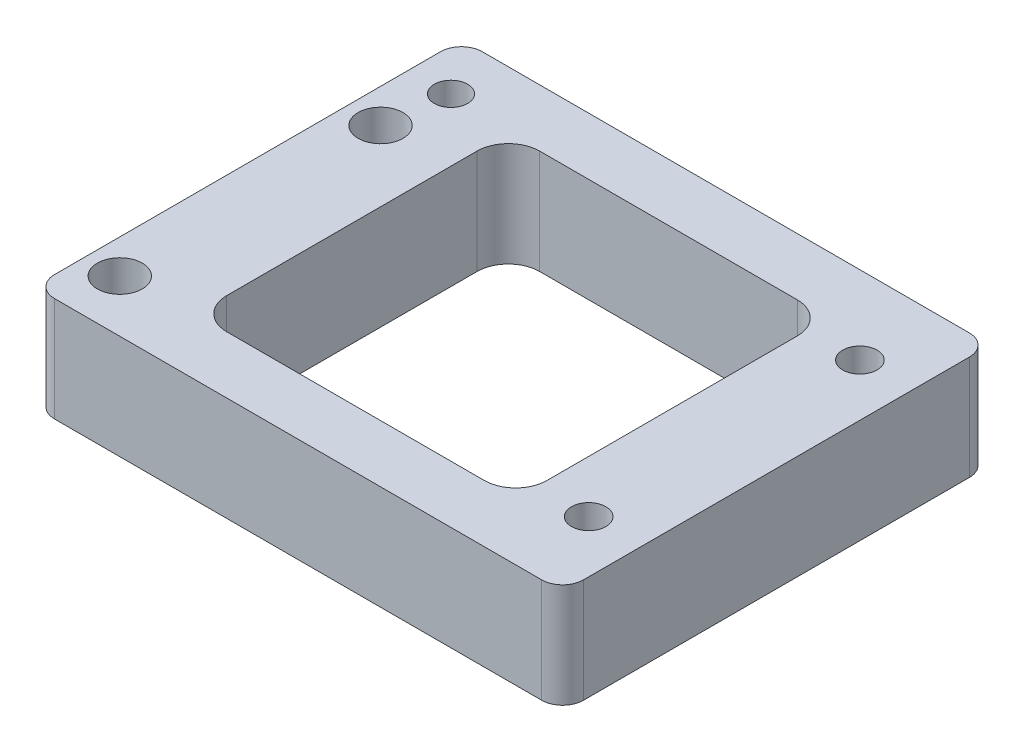
ISO-10303-21;
HEADER;
FILE_DESCRIPTION(('STEP AP214'),'2;1');
FILE_NAME('part.step','',(''),(''),'','','');
FILE_SCHEMA(('AUTOMOTIVE_DESIGN { 1 0 10303 214 1 1 1 1 }'));
ENDSEC;
DATA;
#1=APPLICATION_CONTEXT('core data for automotive mechanical design processes');
#2=APPLICATION_PROTOCOL_DEFINITION('international standard','automotive_design',2000,#1);
#3=PRODUCT_CONTEXT('',#1,'mechanical');
#4=PRODUCT('Part','Part','',(#3));
#5=PRODUCT_RELATED_PRODUCT_CATEGORY('part','',(#4));
#6=PRODUCT_DEFINITION_FORMATION('','',#4);
#7=PRODUCT_DEFINITION_CONTEXT('part definition',#1,'design');
#8=PRODUCT_DEFINITION('design','',#6,#7);
#9=PRODUCT_DEFINITION_SHAPE('','',#8);
#10=(LENGTH_UNIT() NAMED_UNIT(*) SI_UNIT(.MILLI.,.METRE.));
#11=(NAMED_UNIT(*) PLANE_ANGLE_UNIT() SI_UNIT($,.RADIAN.));
#12=(NAMED_UNIT(*) SI_UNIT($,.STERADIAN.) SOLID_ANGLE_UNIT());
#13=UNCERTAINTY_MEASURE_WITH_UNIT(LENGTH_MEASURE(1.E-05),#10,'distance_accuracy_value','');
#14=(GEOMETRIC_REPRESENTATION_CONTEXT(3) GLOBAL_UNCERTAINTY_ASSIGNED_CONTEXT((#13)) GLOBAL_UNIT_ASSIGNED_CONTEXT((#10,
#11,#12)) REPRESENTATION_CONTEXT('',''));
#15=CARTESIAN_POINT('',(0.,0.,0.));
#16=DIRECTION('',(0.,0.,1.));
#17=DIRECTION('',(1.,0.,0.));
#18=AXIS2_PLACEMENT_3D('',#15,#16,#17);
#19=CARTESIAN_POINT('',(0.,10.,0.));
#20=DIRECTION('',(0.,-1.,0.));
#21=DIRECTION('',(0.,0.,-1.));
#22=AXIS2_PLACEMENT_3D('',#19,#20,#21);
#23=PLANE('',#22);
#24=CARTESIAN_POINT('',(45.7,10.,-7.5));
#25=DIRECTION('',(0.,1.,0.));
#26=DIRECTION('',(0.,0.,-1.));
#27=AXIS2_PLACEMENT_3D('',#24,#25,#26);
#28=CIRCLE('',#27,1.64999999999999);
#29=CARTESIAN_POINT('',(45.7,10.,-9.15));
#30=VERTEX_POINT('',#29);
#31=EDGE_CURVE('E286',#30,#30,#28,.T.);
#32=ORIENTED_EDGE('',*,*,#31,.F.);
#33=EDGE_LOOP('',(#32));
#34=FACE_BOUND('',#33,.T.);
#35=CARTESIAN_POINT('',(45.7,10.,-33.5));
#36=DIRECTION('',(0.,1.,0.));
#37=DIRECTION('',(0.,0.,1.));
#38=AXIS2_PLACEMENT_3D('',#35,#36,#37);
#39=CIRCLE('',#38,1.65);
#40=CARTESIAN_POINT('',(45.7,10.,-31.85));
#41=VERTEX_POINT('',#40);
#42=EDGE_CURVE('E176',#41,#41,#39,.T.);
#43=ORIENTED_EDGE('',*,*,#42,.F.);
#44=EDGE_LOOP('',(#43));
#45=FACE_BOUND('',#44,.T.);
#46=DIRECTION('',(-1.,0.,0.));
#47=VECTOR('',#46,1.);
#48=CARTESIAN_POINT('',(0.,10.,-41.));
#49=LINE('',#48,#47);
#50=CARTESIAN_POINT('',(48.7,10.,-41.));
#51=VERTEX_POINT('',#50);
#52=CARTESIAN_POINT('',(2.,10.,-41.));
#53=VERTEX_POINT('',#52);
#54=EDGE_CURVE('E185',#51,#53,#49,.T.);
#55=ORIENTED_EDGE('',*,*,#54,.T.);
#56=CARTESIAN_POINT('',(2.,10.,-39.));
#57=DIRECTION('',(0.,-1.,0.));
#58=DIRECTION('',(0.,0.,-1.));
#59=AXIS2_PLACEMENT_3D('',#56,#57,#58);
#60=CIRCLE('',#59,2.);
#61=CARTESIAN_POINT('',(0.,10.,-39.));
#62=VERTEX_POINT('',#61);
#63=EDGE_CURVE('E206',#53,#62,#60,.F.);
#64=ORIENTED_EDGE('',*,*,#63,.T.);
#65=DIRECTION('',(0.,0.,1.));
#66=VECTOR('',#65,1.);
#67=CARTESIAN_POINT('',(0.,10.,0.));
#68=LINE('',#67,#66);
#69=CARTESIAN_POINT('',(0.,10.,-2.));
#70=VERTEX_POINT('',#69);
#71=EDGE_CURVE('E168',#62,#70,#68,.T.);
#72=ORIENTED_EDGE('',*,*,#71,.T.);
#73=CARTESIAN_POINT('',(2.,10.,-2.));
#74=DIRECTION('',(0.,-1.,0.));
#75=DIRECTION('',(0.,0.,-1.));
#76=AXIS2_PLACEMENT_3D('',#73,#74,#75);
#77=CIRCLE('',#76,2.);
#78=CARTESIAN_POINT('',(2.,10.,0.));
#79=VERTEX_POINT('',#78);
#80=EDGE_CURVE('E204',#70,#79,#77,.F.);
#81=ORIENTED_EDGE('',*,*,#80,.T.);
#82=DIRECTION('',(1.,0.,0.));
#83=VECTOR('',#82,1.);
#84=CARTESIAN_POINT('',(0.,10.,0.));
#85=LINE('',#84,#83);
#86=CARTESIAN_POINT('',(48.7,10.,0.));
#87=VERTEX_POINT('',#86);
#88=EDGE_CURVE('E294',#79,#87,#85,.T.);
#89=ORIENTED_EDGE('',*,*,#88,.T.);
#90=CARTESIAN_POINT('',(48.7,10.,-2.));
#91=DIRECTION('',(0.,-1.,0.));
#92=DIRECTION('',(0.,0.,-1.));
#93=AXIS2_PLACEMENT_3D('',#90,#91,#92);
#94=CIRCLE('',#93,2.);
#95=CARTESIAN_POINT('',(50.7,10.,-2.));
#96=VERTEX_POINT('',#95);
#97=EDGE_CURVE('E200',#87,#96,#94,.F.);
#98=ORIENTED_EDGE('',*,*,#97,.T.);
#99=DIRECTION('',(0.,0.,-1.));
#100=VECTOR('',#99,1.);
#101=CARTESIAN_POINT('',(50.7,10.,0.));
#102=LINE('',#101,#100);
#103=CARTESIAN_POINT('',(50.7,10.,-39.));
#104=VERTEX_POINT('',#103);
#105=EDGE_CURVE('E296',#96,#104,#102,.T.);
#106=ORIENTED_EDGE('',*,*,#105,.T.);
#107=CARTESIAN_POINT('',(48.7,10.,-39.));
#108=DIRECTION('',(0.,-1.,0.));
#109=DIRECTION('',(0.,0.,-1.));
#110=AXIS2_PLACEMENT_3D('',#107,#108,#109);
#111=CIRCLE('',#110,2.);
#112=EDGE_CURVE('E202',#104,#51,#111,.F.);
#113=ORIENTED_EDGE('',*,*,#112,.T.);
#114=EDGE_LOOP('',(#55,#64,#72,#81,#89,#98,#106,#113));
#115=FACE_BOUND('',#114,.T.);
#116=DIRECTION('',(0.,0.,-1.));
#117=VECTOR('',#116,1.);
#118=CARTESIAN_POINT('',(40.7,10.,-5.50000000000001));
#119=LINE('',#118,#117);
#120=CARTESIAN_POINT('',(40.7,10.,-8.50000000000001));
#121=VERTEX_POINT('',#120);
#122=CARTESIAN_POINT('',(40.7,10.,-32.5));
#123=VERTEX_POINT('',#122);
#124=EDGE_CURVE('E268',#121,#123,#119,.T.);
#125=ORIENTED_EDGE('',*,*,#124,.F.);
#126=CARTESIAN_POINT('',(37.7,10.,-8.50000000000001));
#127=DIRECTION('',(0.,-1.,0.));
#128=DIRECTION('',(0.,0.,-1.));
#129=AXIS2_PLACEMENT_3D('',#126,#127,#128);
#130=CIRCLE('',#129,3.);
#131=CARTESIAN_POINT('',(37.7,10.,-5.50000000000001));
#132=VERTEX_POINT('',#131);
#133=EDGE_CURVE('E243',#121,#132,#130,.T.);
#134=ORIENTED_EDGE('',*,*,#133,.T.);
#135=DIRECTION('',(1.,0.,0.));
#136=VECTOR('',#135,1.);
#137=CARTESIAN_POINT('',(10.,10.,-5.50000000000001));
#138=LINE('',#137,#136);
#139=CARTESIAN_POINT('',(13.,10.,-5.50000000000001));
#140=VERTEX_POINT('',#139);
#141=EDGE_CURVE('E270',#140,#132,#138,.T.);
#142=ORIENTED_EDGE('',*,*,#141,.F.);
#143=CARTESIAN_POINT('',(13.,10.,-8.50000000000001));
#144=DIRECTION('',(0.,-1.,0.));
#145=DIRECTION('',(0.,0.,-1.));
#146=AXIS2_PLACEMENT_3D('',#143,#144,#145);
#147=CIRCLE('',#146,3.);
#148=CARTESIAN_POINT('',(10.,10.,-8.50000000000001));
#149=VERTEX_POINT('',#148);
#150=EDGE_CURVE('E239',#140,#149,#147,.T.);
#151=ORIENTED_EDGE('',*,*,#150,.T.);
#152=DIRECTION('',(0.,0.,1.));
#153=VECTOR('',#152,1.);
#154=CARTESIAN_POINT('',(10.,10.,-5.50000000000001));
#155=LINE('',#154,#153);
#156=CARTESIAN_POINT('',(10.,10.,-32.5));
#157=VERTEX_POINT('',#156);
#158=EDGE_CURVE('E267',#157,#149,#155,.T.);
#159=ORIENTED_EDGE('',*,*,#158,.F.);
#160=CARTESIAN_POINT('',(13.,10.,-32.5));
#161=DIRECTION('',(0.,-1.,0.));
#162=DIRECTION('',(0.,0.,-1.));
#163=AXIS2_PLACEMENT_3D('',#160,#161,#162);
#164=CIRCLE('',#163,3.);
#165=CARTESIAN_POINT('',(13.,10.,-35.5));
#166=VERTEX_POINT('',#165);
#167=EDGE_CURVE('E11',#157,#166,#164,.T.);
#168=ORIENTED_EDGE('',*,*,#167,.T.);
#169=DIRECTION('',(-1.,0.,0.));
#170=VECTOR('',#169,1.);
#171=CARTESIAN_POINT('',(10.,10.,-35.5));
#172=LINE('',#171,#170);
#173=CARTESIAN_POINT('',(37.7,10.,-35.5));
#174=VERTEX_POINT('',#173);
#175=EDGE_CURVE('E265',#174,#166,#172,.T.);
#176=ORIENTED_EDGE('',*,*,#175,.F.);
#177=CARTESIAN_POINT('',(37.7,10.,-32.5));
#178=DIRECTION('',(0.,-1.,0.));
#179=DIRECTION('',(0.,0.,-1.));
#180=AXIS2_PLACEMENT_3D('',#177,#178,#179);
#181=CIRCLE('',#180,3.);
#182=EDGE_CURVE('E247',#174,#123,#181,.T.);
#183=ORIENTED_EDGE('',*,*,#182,.T.);
#184=EDGE_LOOP('',(#125,#134,#142,#151,#159,#168,#176,#183));
#185=FACE_BOUND('',#184,.T.);
#186=CARTESIAN_POINT('',(4.,10.,-36.));
#187=DIRECTION('',(0.,1.,0.));
#188=DIRECTION('',(0.,0.,1.));
#189=AXIS2_PLACEMENT_3D('',#186,#187,#188);
#190=CIRCLE('',#189,1.6);
#191=CARTESIAN_POINT('',(4.,10.,-34.4));
#192=VERTEX_POINT('',#191);
#193=EDGE_CURVE('E282',#192,#192,#190,.T.);
#194=ORIENTED_EDGE('',*,*,#193,.F.);
#195=EDGE_LOOP('',(#194));
#196=FACE_BOUND('',#195,.T.);
#197=CARTESIAN_POINT('',(3.25,10.,-30.));
#198=DIRECTION('',(0.,1.,0.));
#199=DIRECTION('',(0.,0.,1.));
#200=AXIS2_PLACEMENT_3D('',#197,#198,#199);
#201=CIRCLE('',#200,2.15);
#202=CARTESIAN_POINT('',(3.25,10.,-27.85));
#203=VERTEX_POINT('',#202);
#204=EDGE_CURVE('E547',#203,#203,#201,.T.);
#205=ORIENTED_EDGE('',*,*,#204,.F.);
#206=EDGE_LOOP('',(#205));
#207=FACE_BOUND('',#206,.T.);
#208=CARTESIAN_POINT('',(3.25,10.,-5.));
#209=DIRECTION('',(0.,1.,0.));
#210=DIRECTION('',(0.,0.,1.));
#211=AXIS2_PLACEMENT_3D('',#208,#209,#210);
#212=CIRCLE('',#211,2.15);
#213=CARTESIAN_POINT('',(3.25,10.,-2.85));
#214=VERTEX_POINT('',#213);
#215=EDGE_CURVE('E550',#214,#214,#212,.T.);
#216=ORIENTED_EDGE('',*,*,#215,.F.);
#217=EDGE_LOOP('',(#216));
#218=FACE_BOUND('',#217,.T.);
#219=ADVANCED_FACE('F35',(#34,#45,#115,#185,#196,#207,#218),#23,.F.);
#220=CARTESIAN_POINT('',(0.,0.,0.));
#221=DIRECTION('',(0.,-1.,0.));
#222=DIRECTION('',(0.,0.,-1.));
#223=AXIS2_PLACEMENT_3D('',#220,#221,#222);
#224=PLANE('',#223);
#225=CARTESIAN_POINT('',(3.25,0.,-30.));
#226=DIRECTION('',(0.,1.,0.));
#227=DIRECTION('',(0.,0.,1.));
#228=AXIS2_PLACEMENT_3D('',#225,#226,#227);
#229=CIRCLE('',#228,2.15);
#230=CARTESIAN_POINT('',(3.25,0.,-27.85));
#231=VERTEX_POINT('',#230);
#232=EDGE_CURVE('E551',#231,#231,#229,.T.);
#233=ORIENTED_EDGE('',*,*,#232,.T.);
#234=EDGE_LOOP('',(#233));
#235=FACE_BOUND('',#234,.T.);
#236=DIRECTION('',(0.,0.,1.));
#237=VECTOR('',#236,1.);
#238=CARTESIAN_POINT('',(10.,0.,-5.50000000000001));
#239=LINE('',#238,#237);
#240=CARTESIAN_POINT('',(10.,0.,-32.5));
#241=VERTEX_POINT('',#240);
#242=CARTESIAN_POINT('',(10.,0.,-8.50000000000001));
#243=VERTEX_POINT('',#242);
#244=EDGE_CURVE('E253',#241,#243,#239,.T.);
#245=ORIENTED_EDGE('',*,*,#244,.T.);
#246=CARTESIAN_POINT('',(13.,0.,-8.50000000000001));
#247=DIRECTION('',(0.,-1.,0.));
#248=DIRECTION('',(0.,0.,-1.));
#249=AXIS2_PLACEMENT_3D('',#246,#247,#248);
#250=CIRCLE('',#249,3.);
#251=CARTESIAN_POINT('',(13.,0.,-5.50000000000001));
#252=VERTEX_POINT('',#251);
#253=EDGE_CURVE('E237',#243,#252,#250,.F.);
#254=ORIENTED_EDGE('',*,*,#253,.T.);
#255=DIRECTION('',(1.,0.,0.));
#256=VECTOR('',#255,1.);
#257=CARTESIAN_POINT('',(10.,0.,-5.50000000000001));
#258=LINE('',#257,#256);
#259=CARTESIAN_POINT('',(37.7,0.,-5.50000000000001));
#260=VERTEX_POINT('',#259);
#261=EDGE_CURVE('E262',#252,#260,#258,.T.);
#262=ORIENTED_EDGE('',*,*,#261,.T.);
#263=CARTESIAN_POINT('',(37.7,0.,-8.50000000000001));
#264=DIRECTION('',(0.,-1.,0.));
#265=DIRECTION('',(0.,0.,-1.));
#266=AXIS2_PLACEMENT_3D('',#263,#264,#265);
#267=CIRCLE('',#266,3.);
#268=CARTESIAN_POINT('',(40.7,0.,-8.50000000000001));
#269=VERTEX_POINT('',#268);
#270=EDGE_CURVE('E241',#260,#269,#267,.F.);
#271=ORIENTED_EDGE('',*,*,#270,.T.);
#272=DIRECTION('',(0.,0.,-1.));
#273=VECTOR('',#272,1.);
#274=CARTESIAN_POINT('',(40.7,0.,-5.50000000000001));
#275=LINE('',#274,#273);
#276=CARTESIAN_POINT('',(40.7,0.,-32.5));
#277=VERTEX_POINT('',#276);
#278=EDGE_CURVE('E279',#269,#277,#275,.T.);
#279=ORIENTED_EDGE('',*,*,#278,.T.);
#280=CARTESIAN_POINT('',(37.7,0.,-32.5));
#281=DIRECTION('',(0.,-1.,0.));
#282=DIRECTION('',(0.,0.,-1.));
#283=AXIS2_PLACEMENT_3D('',#280,#281,#282);
#284=CIRCLE('',#283,3.);
#285=CARTESIAN_POINT('',(37.7,0.,-35.5));
#286=VERTEX_POINT('',#285);
#287=EDGE_CURVE('E245',#277,#286,#284,.F.);
#288=ORIENTED_EDGE('',*,*,#287,.T.);
#289=DIRECTION('',(-1.,0.,0.));
#290=VECTOR('',#289,1.);
#291=CARTESIAN_POINT('',(10.,0.,-35.5));
#292=LINE('',#291,#290);
#293=CARTESIAN_POINT('',(13.,0.,-35.5));
#294=VERTEX_POINT('',#293);
#295=EDGE_CURVE('E254',#286,#294,#292,.T.);
#296=ORIENTED_EDGE('',*,*,#295,.T.);
#297=CARTESIAN_POINT('',(13.,0.,-32.5));
#298=DIRECTION('',(0.,-1.,0.));
#299=DIRECTION('',(0.,0.,-1.));
#300=AXIS2_PLACEMENT_3D('',#297,#298,#299);
#301=CIRCLE('',#300,3.);
#302=EDGE_CURVE('E43',#294,#241,#301,.F.);
#303=ORIENTED_EDGE('',*,*,#302,.T.);
#304=EDGE_LOOP('',(#245,#254,#262,#271,#279,#288,#296,#303));
#305=FACE_BOUND('',#304,.T.);
#306=CARTESIAN_POINT('',(45.7,0.,-7.5));
#307=DIRECTION('',(0.,1.,0.));
#308=DIRECTION('',(0.,0.,-1.));
#309=AXIS2_PLACEMENT_3D('',#306,#307,#308);
#310=CIRCLE('',#309,1.64999999999999);
#311=CARTESIAN_POINT('',(45.7,0.,-9.15));
#312=VERTEX_POINT('',#311);
#313=EDGE_CURVE('E278',#312,#312,#310,.T.);
#314=ORIENTED_EDGE('',*,*,#313,.T.);
#315=EDGE_LOOP('',(#314));
#316=FACE_BOUND('',#315,.T.);
#317=DIRECTION('',(0.,0.,1.));
#318=VECTOR('',#317,1.);
#319=CARTESIAN_POINT('',(0.,0.,0.));
#320=LINE('',#319,#318);
#321=CARTESIAN_POINT('',(0.,0.,-39.));
#322=VERTEX_POINT('',#321);
#323=CARTESIAN_POINT('',(0.,0.,-2.));
#324=VERTEX_POINT('',#323);
#325=EDGE_CURVE('E165',#322,#324,#320,.T.);
#326=ORIENTED_EDGE('',*,*,#325,.F.);
#327=CARTESIAN_POINT('',(2.,0.,-39.));
#328=DIRECTION('',(0.,-1.,0.));
#329=DIRECTION('',(0.,0.,-1.));
#330=AXIS2_PLACEMENT_3D('',#327,#328,#329);
#331=CIRCLE('',#330,2.);
#332=CARTESIAN_POINT('',(2.,0.,-41.));
#333=VERTEX_POINT('',#332);
#334=EDGE_CURVE('E148',#322,#333,#331,.T.);
#335=ORIENTED_EDGE('',*,*,#334,.T.);
#336=DIRECTION('',(-1.,0.,0.));
#337=VECTOR('',#336,1.);
#338=CARTESIAN_POINT('',(0.,0.,-41.));
#339=LINE('',#338,#337);
#340=CARTESIAN_POINT('',(48.7,0.,-41.));
#341=VERTEX_POINT('',#340);
#342=EDGE_CURVE('E190',#341,#333,#339,.T.);
#343=ORIENTED_EDGE('',*,*,#342,.F.);
#344=CARTESIAN_POINT('',(48.7,0.,-39.));
#345=DIRECTION('',(0.,-1.,0.));
#346=DIRECTION('',(0.,0.,-1.));
#347=AXIS2_PLACEMENT_3D('',#344,#345,#346);
#348=CIRCLE('',#347,2.);
#349=CARTESIAN_POINT('',(50.7,0.,-39.));
#350=VERTEX_POINT('',#349);
#351=EDGE_CURVE('E194',#341,#350,#348,.T.);
#352=ORIENTED_EDGE('',*,*,#351,.T.);
#353=DIRECTION('',(0.,0.,-1.));
#354=VECTOR('',#353,1.);
#355=CARTESIAN_POINT('',(50.7,0.,0.));
#356=LINE('',#355,#354);
#357=CARTESIAN_POINT('',(50.7,0.,-2.));
#358=VERTEX_POINT('',#357);
#359=EDGE_CURVE('E179',#358,#350,#356,.T.);
#360=ORIENTED_EDGE('',*,*,#359,.F.);
#361=CARTESIAN_POINT('',(48.7,0.,-2.));
#362=DIRECTION('',(0.,-1.,0.));
#363=DIRECTION('',(0.,0.,-1.));
#364=AXIS2_PLACEMENT_3D('',#361,#362,#363);
#365=CIRCLE('',#364,2.);
#366=CARTESIAN_POINT('',(48.7,0.,0.));
#367=VERTEX_POINT('',#366);
#368=EDGE_CURVE('E169',#358,#367,#365,.T.);
#369=ORIENTED_EDGE('',*,*,#368,.T.);
#370=DIRECTION('',(1.,0.,0.));
#371=VECTOR('',#370,1.);
#372=CARTESIAN_POINT('',(0.,0.,0.));
#373=LINE('',#372,#371);
#374=CARTESIAN_POINT('',(2.,0.,0.));
#375=VERTEX_POINT('',#374);
#376=EDGE_CURVE('E175',#375,#367,#373,.T.);
#377=ORIENTED_EDGE('',*,*,#376,.F.);
#378=CARTESIAN_POINT('',(2.,0.,-2.));
#379=DIRECTION('',(0.,-1.,0.));
#380=DIRECTION('',(0.,0.,-1.));
#381=AXIS2_PLACEMENT_3D('',#378,#379,#380);
#382=CIRCLE('',#381,2.);
#383=EDGE_CURVE('E159',#375,#324,#382,.T.);
#384=ORIENTED_EDGE('',*,*,#383,.T.);
#385=EDGE_LOOP('',(#326,#335,#343,#352,#360,#369,#377,#384));
#386=FACE_BOUND('',#385,.T.);
#387=CARTESIAN_POINT('',(45.7,0.,-33.5));
#388=DIRECTION('',(0.,1.,0.));
#389=DIRECTION('',(0.,0.,1.));
#390=AXIS2_PLACEMENT_3D('',#387,#388,#389);
#391=CIRCLE('',#390,1.65);
#392=CARTESIAN_POINT('',(45.7,0.,-31.85));
#393=VERTEX_POINT('',#392);
#394=EDGE_CURVE('E182',#393,#393,#391,.T.);
#395=ORIENTED_EDGE('',*,*,#394,.T.);
#396=EDGE_LOOP('',(#395));
#397=FACE_BOUND('',#396,.T.);
#398=CARTESIAN_POINT('',(4.,0.,-36.));
#399=DIRECTION('',(0.,1.,0.));
#400=DIRECTION('',(0.,0.,1.));
#401=AXIS2_PLACEMENT_3D('',#398,#399,#400);
#402=CIRCLE('',#401,1.6);
#403=CARTESIAN_POINT('',(4.,0.,-34.4));
#404=VERTEX_POINT('',#403);
#405=EDGE_CURVE('E559',#404,#404,#402,.T.);
#406=ORIENTED_EDGE('',*,*,#405,.T.);
#407=EDGE_LOOP('',(#406));
#408=FACE_BOUND('',#407,.T.);
#409=CARTESIAN_POINT('',(3.25,0.,-5.));
#410=DIRECTION('',(0.,1.,0.));
#411=DIRECTION('',(0.,0.,1.));
#412=AXIS2_PLACEMENT_3D('',#409,#410,#411);
#413=CIRCLE('',#412,2.15);
#414=CARTESIAN_POINT('',(3.25,0.,-2.85));
#415=VERTEX_POINT('',#414);
#416=EDGE_CURVE('E552',#415,#415,#413,.T.);
#417=ORIENTED_EDGE('',*,*,#416,.T.);
#418=EDGE_LOOP('',(#417));
#419=FACE_BOUND('',#418,.T.);
#420=ADVANCED_FACE('F172',(#235,#305,#316,#386,#397,#408,#419),#224,.T.);
#421=CARTESIAN_POINT('',(0.,10.,0.));
#422=DIRECTION('',(1.,0.,0.));
#423=DIRECTION('',(0.,0.,-1.));
#424=AXIS2_PLACEMENT_3D('',#421,#422,#423);
#425=PLANE('',#424);
#426=ORIENTED_EDGE('',*,*,#71,.F.);
#427=DIRECTION('',(0.,-1.,0.));
#428=VECTOR('',#427,1.);
#429=CARTESIAN_POINT('',(0.,10.,-39.));
#430=LINE('',#429,#428);
#431=EDGE_CURVE('E152',#62,#322,#430,.T.);
#432=ORIENTED_EDGE('',*,*,#431,.T.);
#433=ORIENTED_EDGE('',*,*,#325,.T.);
#434=DIRECTION('',(0.,-1.,0.));
#435=VECTOR('',#434,1.);
#436=CARTESIAN_POINT('',(0.,10.,-2.));
#437=LINE('',#436,#435);
#438=EDGE_CURVE('E170',#324,#70,#437,.F.);
#439=ORIENTED_EDGE('',*,*,#438,.T.);
#440=EDGE_LOOP('',(#426,#432,#433,#439));
#441=FACE_BOUND('',#440,.T.);
#442=ADVANCED_FACE('F164',(#441),#425,.F.);
#443=CARTESIAN_POINT('',(0.,10.,0.));
#444=DIRECTION('',(0.,0.,-1.));
#445=DIRECTION('',(-1.,0.,0.));
#446=AXIS2_PLACEMENT_3D('',#443,#444,#445);
#447=PLANE('',#446);
#448=ORIENTED_EDGE('',*,*,#88,.F.);
#449=DIRECTION('',(0.,-1.,0.));
#450=VECTOR('',#449,1.);
#451=CARTESIAN_POINT('',(2.,10.,0.));
#452=LINE('',#451,#450);
#453=EDGE_CURVE('E210',#79,#375,#452,.T.);
#454=ORIENTED_EDGE('',*,*,#453,.T.);
#455=ORIENTED_EDGE('',*,*,#376,.T.);
#456=DIRECTION('',(0.,-1.,0.));
#457=VECTOR('',#456,1.);
#458=CARTESIAN_POINT('',(48.7,10.,0.));
#459=LINE('',#458,#457);
#460=EDGE_CURVE('E208',#367,#87,#459,.F.);
#461=ORIENTED_EDGE('',*,*,#460,.T.);
#462=EDGE_LOOP('',(#448,#454,#455,#461));
#463=FACE_BOUND('',#462,.T.);
#464=ADVANCED_FACE('F319',(#463),#447,.F.);
#465=CARTESIAN_POINT('',(50.7,10.,0.));
#466=DIRECTION('',(-1.,0.,0.));
#467=DIRECTION('',(0.,0.,1.));
#468=AXIS2_PLACEMENT_3D('',#465,#466,#467);
#469=PLANE('',#468);
#470=ORIENTED_EDGE('',*,*,#359,.T.);
#471=DIRECTION('',(0.,-1.,0.));
#472=VECTOR('',#471,1.);
#473=CARTESIAN_POINT('',(50.7,10.,-39.));
#474=LINE('',#473,#472);
#475=EDGE_CURVE('E216',#350,#104,#474,.F.);
#476=ORIENTED_EDGE('',*,*,#475,.T.);
#477=ORIENTED_EDGE('',*,*,#105,.F.);
#478=DIRECTION('',(0.,-1.,0.));
#479=VECTOR('',#478,1.);
#480=CARTESIAN_POINT('',(50.7,10.,-2.));
#481=LINE('',#480,#479);
#482=EDGE_CURVE('E213',#96,#358,#481,.T.);
#483=ORIENTED_EDGE('',*,*,#482,.T.);
#484=EDGE_LOOP('',(#470,#476,#477,#483));
#485=FACE_BOUND('',#484,.T.);
#486=ADVANCED_FACE('F311',(#485),#469,.F.);
#487=CARTESIAN_POINT('',(0.,10.,-41.));
#488=DIRECTION('',(0.,0.,1.));
#489=DIRECTION('',(1.,0.,0.));
#490=AXIS2_PLACEMENT_3D('',#487,#488,#489);
#491=PLANE('',#490);
#492=ORIENTED_EDGE('',*,*,#342,.T.);
#493=DIRECTION('',(0.,-1.,0.));
#494=VECTOR('',#493,1.);
#495=CARTESIAN_POINT('',(2.,10.,-41.));
#496=LINE('',#495,#494);
#497=EDGE_CURVE('E153',#333,#53,#496,.F.);
#498=ORIENTED_EDGE('',*,*,#497,.T.);
#499=ORIENTED_EDGE('',*,*,#54,.F.);
#500=DIRECTION('',(0.,-1.,0.));
#501=VECTOR('',#500,1.);
#502=CARTESIAN_POINT('',(48.7,10.,-41.));
#503=LINE('',#502,#501);
#504=EDGE_CURVE('E158',#51,#341,#503,.T.);
#505=ORIENTED_EDGE('',*,*,#504,.T.);
#506=EDGE_LOOP('',(#492,#498,#499,#505));
#507=FACE_BOUND('',#506,.T.);
#508=ADVANCED_FACE('F305',(#507),#491,.F.);
#509=CARTESIAN_POINT('',(45.7,10.,-33.5));
#510=DIRECTION('',(0.,-1.,0.));
#511=DIRECTION('',(0.,0.,-1.));
#512=AXIS2_PLACEMENT_3D('',#509,#510,#511);
#513=CYLINDRICAL_SURFACE('',#512,1.65);
#514=ORIENTED_EDGE('',*,*,#42,.T.);
#515=EDGE_LOOP('',(#514));
#516=FACE_BOUND('',#515,.T.);
#517=ORIENTED_EDGE('',*,*,#394,.F.);
#518=EDGE_LOOP('',(#517));
#519=FACE_BOUND('',#518,.T.);
#520=ADVANCED_FACE('F344',(#516,#519),#513,.F.);
#521=CARTESIAN_POINT('',(45.7,10.,-7.5));
#522=DIRECTION('',(0.,-1.,0.));
#523=DIRECTION('',(0.,0.,-1.));
#524=AXIS2_PLACEMENT_3D('',#521,#522,#523);
#525=CYLINDRICAL_SURFACE('',#524,1.64999999999999);
#526=ORIENTED_EDGE('',*,*,#31,.T.);
#527=EDGE_LOOP('',(#526));
#528=FACE_BOUND('',#527,.T.);
#529=ORIENTED_EDGE('',*,*,#313,.F.);
#530=EDGE_LOOP('',(#529));
#531=FACE_BOUND('',#530,.T.);
#532=ADVANCED_FACE('F378',(#528,#531),#525,.F.);
#533=CARTESIAN_POINT('',(40.7,10.,-5.50000000000001));
#534=DIRECTION('',(-1.,0.,0.));
#535=DIRECTION('',(0.,0.,1.));
#536=AXIS2_PLACEMENT_3D('',#533,#534,#535);
#537=PLANE('',#536);
#538=ORIENTED_EDGE('',*,*,#278,.F.);
#539=DIRECTION('',(0.,-1.,0.));
#540=VECTOR('',#539,1.);
#541=CARTESIAN_POINT('',(40.7,10.,-8.50000000000001));
#542=LINE('',#541,#540);
#543=EDGE_CURVE('E231',#269,#121,#542,.F.);
#544=ORIENTED_EDGE('',*,*,#543,.T.);
#545=ORIENTED_EDGE('',*,*,#124,.T.);
#546=DIRECTION('',(0.,-1.,0.));
#547=VECTOR('',#546,1.);
#548=CARTESIAN_POINT('',(40.7,0.,-32.5));
#549=LINE('',#548,#547);
#550=EDGE_CURVE('E228',#123,#277,#549,.T.);
#551=ORIENTED_EDGE('',*,*,#550,.T.);
#552=EDGE_LOOP('',(#538,#544,#545,#551));
#553=FACE_BOUND('',#552,.T.);
#554=ADVANCED_FACE('F385',(#553),#537,.T.);
#555=CARTESIAN_POINT('',(10.,10.,-35.5));
#556=DIRECTION('',(0.,0.,1.));
#557=DIRECTION('',(1.,0.,0.));
#558=AXIS2_PLACEMENT_3D('',#555,#556,#557);
#559=PLANE('',#558);
#560=ORIENTED_EDGE('',*,*,#295,.F.);
#561=DIRECTION('',(0.,-1.,0.));
#562=VECTOR('',#561,1.);
#563=CARTESIAN_POINT('',(37.7,10.,-35.5));
#564=LINE('',#563,#562);
#565=EDGE_CURVE('E55',#286,#174,#564,.F.);
#566=ORIENTED_EDGE('',*,*,#565,.T.);
#567=ORIENTED_EDGE('',*,*,#175,.T.);
#568=DIRECTION('',(0.,-1.,0.));
#569=VECTOR('',#568,1.);
#570=CARTESIAN_POINT('',(13.,0.,-35.5));
#571=LINE('',#570,#569);
#572=EDGE_CURVE('E233',#166,#294,#571,.T.);
#573=ORIENTED_EDGE('',*,*,#572,.T.);
#574=EDGE_LOOP('',(#560,#566,#567,#573));
#575=FACE_BOUND('',#574,.T.);
#576=ADVANCED_FACE('F264',(#575),#559,.T.);
#577=CARTESIAN_POINT('',(10.,10.,-5.50000000000001));
#578=DIRECTION('',(1.,0.,0.));
#579=DIRECTION('',(0.,0.,-1.));
#580=AXIS2_PLACEMENT_3D('',#577,#578,#579);
#581=PLANE('',#580);
#582=ORIENTED_EDGE('',*,*,#158,.T.);
#583=DIRECTION('',(0.,-1.,0.));
#584=VECTOR('',#583,1.);
#585=CARTESIAN_POINT('',(10.,0.,-8.50000000000001));
#586=LINE('',#585,#584);
#587=EDGE_CURVE('E220',#149,#243,#586,.T.);
#588=ORIENTED_EDGE('',*,*,#587,.T.);
#589=ORIENTED_EDGE('',*,*,#244,.F.);
#590=DIRECTION('',(0.,-1.,0.));
#591=VECTOR('',#590,1.);
#592=CARTESIAN_POINT('',(10.,10.,-32.5));
#593=LINE('',#592,#591);
#594=EDGE_CURVE('E218',#241,#157,#593,.F.);
#595=ORIENTED_EDGE('',*,*,#594,.T.);
#596=EDGE_LOOP('',(#582,#588,#589,#595));
#597=FACE_BOUND('',#596,.T.);
#598=ADVANCED_FACE('F260',(#597),#581,.T.);
#599=CARTESIAN_POINT('',(10.,10.,-5.50000000000001));
#600=DIRECTION('',(0.,0.,-1.));
#601=DIRECTION('',(-1.,0.,0.));
#602=AXIS2_PLACEMENT_3D('',#599,#600,#601);
#603=PLANE('',#602);
#604=ORIENTED_EDGE('',*,*,#261,.F.);
#605=DIRECTION('',(0.,-1.,0.));
#606=VECTOR('',#605,1.);
#607=CARTESIAN_POINT('',(13.,10.,-5.50000000000001));
#608=LINE('',#607,#606);
#609=EDGE_CURVE('E226',#252,#140,#608,.F.);
#610=ORIENTED_EDGE('',*,*,#609,.T.);
#611=ORIENTED_EDGE('',*,*,#141,.T.);
#612=DIRECTION('',(0.,-1.,0.));
#613=VECTOR('',#612,1.);
#614=CARTESIAN_POINT('',(37.7,0.,-5.50000000000001));
#615=LINE('',#614,#613);
#616=EDGE_CURVE('E223',#132,#260,#615,.T.);
#617=ORIENTED_EDGE('',*,*,#616,.T.);
#618=EDGE_LOOP('',(#604,#610,#611,#617));
#619=FACE_BOUND('',#618,.T.);
#620=ADVANCED_FACE('F406',(#619),#603,.T.);
#621=CARTESIAN_POINT('',(4.,10.,-36.));
#622=DIRECTION('',(0.,-1.,0.));
#623=DIRECTION('',(0.,0.,-1.));
#624=AXIS2_PLACEMENT_3D('',#621,#622,#623);
#625=CYLINDRICAL_SURFACE('',#624,1.6);
#626=ORIENTED_EDGE('',*,*,#193,.T.);
#627=EDGE_LOOP('',(#626));
#628=FACE_BOUND('',#627,.T.);
#629=ORIENTED_EDGE('',*,*,#405,.F.);
#630=EDGE_LOOP('',(#629));
#631=FACE_BOUND('',#630,.T.);
#632=ADVANCED_FACE('F413',(#628,#631),#625,.F.);
#633=CARTESIAN_POINT('',(3.25,10.,-30.));
#634=DIRECTION('',(0.,-1.,0.));
#635=DIRECTION('',(0.,0.,-1.));
#636=AXIS2_PLACEMENT_3D('',#633,#634,#635);
#637=CYLINDRICAL_SURFACE('',#636,2.15);
#638=ORIENTED_EDGE('',*,*,#204,.T.);
#639=EDGE_LOOP('',(#638));
#640=FACE_BOUND('',#639,.T.);
#641=ORIENTED_EDGE('',*,*,#232,.F.);
#642=EDGE_LOOP('',(#641));
#643=FACE_BOUND('',#642,.T.);
#644=ADVANCED_FACE('F421',(#640,#643),#637,.F.);
#645=CARTESIAN_POINT('',(3.25,10.,-5.));
#646=DIRECTION('',(0.,-1.,0.));
#647=DIRECTION('',(0.,0.,-1.));
#648=AXIS2_PLACEMENT_3D('',#645,#646,#647);
#649=CYLINDRICAL_SURFACE('',#648,2.15);
#650=ORIENTED_EDGE('',*,*,#215,.T.);
#651=EDGE_LOOP('',(#650));
#652=FACE_BOUND('',#651,.T.);
#653=ORIENTED_EDGE('',*,*,#416,.F.);
#654=EDGE_LOOP('',(#653));
#655=FACE_BOUND('',#654,.T.);
#656=ADVANCED_FACE('F331',(#652,#655),#649,.F.);
#657=CARTESIAN_POINT('',(2.,10.,-39.));
#658=DIRECTION('',(0.,-1.,0.));
#659=DIRECTION('',(0.,0.,-1.));
#660=AXIS2_PLACEMENT_3D('',#657,#658,#659);
#661=CYLINDRICAL_SURFACE('',#660,2.);
#662=ORIENTED_EDGE('',*,*,#63,.F.);
#663=ORIENTED_EDGE('',*,*,#497,.F.);
#664=ORIENTED_EDGE('',*,*,#334,.F.);
#665=ORIENTED_EDGE('',*,*,#431,.F.);
#666=EDGE_LOOP('',(#662,#663,#664,#665));
#667=FACE_BOUND('',#666,.T.);
#668=ADVANCED_FACE('F151',(#667),#661,.T.);
#669=CARTESIAN_POINT('',(2.,10.,-2.));
#670=DIRECTION('',(0.,-1.,0.));
#671=DIRECTION('',(0.,0.,-1.));
#672=AXIS2_PLACEMENT_3D('',#669,#670,#671);
#673=CYLINDRICAL_SURFACE('',#672,2.);
#674=ORIENTED_EDGE('',*,*,#80,.F.);
#675=ORIENTED_EDGE('',*,*,#438,.F.);
#676=ORIENTED_EDGE('',*,*,#383,.F.);
#677=ORIENTED_EDGE('',*,*,#453,.F.);
#678=EDGE_LOOP('',(#674,#675,#676,#677));
#679=FACE_BOUND('',#678,.T.);
#680=ADVANCED_FACE('F323',(#679),#673,.T.);
#681=CARTESIAN_POINT('',(48.7,10.,-39.));
#682=DIRECTION('',(0.,-1.,0.));
#683=DIRECTION('',(0.,0.,-1.));
#684=AXIS2_PLACEMENT_3D('',#681,#682,#683);
#685=CYLINDRICAL_SURFACE('',#684,2.);
#686=ORIENTED_EDGE('',*,*,#112,.F.);
#687=ORIENTED_EDGE('',*,*,#475,.F.);
#688=ORIENTED_EDGE('',*,*,#351,.F.);
#689=ORIENTED_EDGE('',*,*,#504,.F.);
#690=EDGE_LOOP('',(#686,#687,#688,#689));
#691=FACE_BOUND('',#690,.T.);
#692=ADVANCED_FACE('F307',(#691),#685,.T.);
#693=CARTESIAN_POINT('',(48.7,10.,-2.));
#694=DIRECTION('',(0.,-1.,0.));
#695=DIRECTION('',(0.,0.,-1.));
#696=AXIS2_PLACEMENT_3D('',#693,#694,#695);
#697=CYLINDRICAL_SURFACE('',#696,2.);
#698=ORIENTED_EDGE('',*,*,#97,.F.);
#699=ORIENTED_EDGE('',*,*,#460,.F.);
#700=ORIENTED_EDGE('',*,*,#368,.F.);
#701=ORIENTED_EDGE('',*,*,#482,.F.);
#702=EDGE_LOOP('',(#698,#699,#700,#701));
#703=FACE_BOUND('',#702,.T.);
#704=ADVANCED_FACE('F315',(#703),#697,.T.);
#705=CARTESIAN_POINT('',(13.,10.,-8.50000000000001));
#706=DIRECTION('',(0.,1.,0.));
#707=DIRECTION('',(0.,0.,1.));
#708=AXIS2_PLACEMENT_3D('',#705,#706,#707);
#709=CYLINDRICAL_SURFACE('',#708,3.);
#710=ORIENTED_EDGE('',*,*,#150,.F.);
#711=ORIENTED_EDGE('',*,*,#609,.F.);
#712=ORIENTED_EDGE('',*,*,#253,.F.);
#713=ORIENTED_EDGE('',*,*,#587,.F.);
#714=EDGE_LOOP('',(#710,#711,#712,#713));
#715=FACE_BOUND('',#714,.T.);
#716=ADVANCED_FACE('F457',(#715),#709,.F.);
#717=CARTESIAN_POINT('',(37.7,10.,-8.50000000000001));
#718=DIRECTION('',(0.,1.,0.));
#719=DIRECTION('',(0.,0.,1.));
#720=AXIS2_PLACEMENT_3D('',#717,#718,#719);
#721=CYLINDRICAL_SURFACE('',#720,3.);
#722=ORIENTED_EDGE('',*,*,#133,.F.);
#723=ORIENTED_EDGE('',*,*,#543,.F.);
#724=ORIENTED_EDGE('',*,*,#270,.F.);
#725=ORIENTED_EDGE('',*,*,#616,.F.);
#726=EDGE_LOOP('',(#722,#723,#724,#725));
#727=FACE_BOUND('',#726,.T.);
#728=ADVANCED_FACE('F500',(#727),#721,.F.);
#729=CARTESIAN_POINT('',(37.7,10.,-32.5));
#730=DIRECTION('',(0.,1.,0.));
#731=DIRECTION('',(0.,0.,1.));
#732=AXIS2_PLACEMENT_3D('',#729,#730,#731);
#733=CYLINDRICAL_SURFACE('',#732,3.);
#734=ORIENTED_EDGE('',*,*,#182,.F.);
#735=ORIENTED_EDGE('',*,*,#565,.F.);
#736=ORIENTED_EDGE('',*,*,#287,.F.);
#737=ORIENTED_EDGE('',*,*,#550,.F.);
#738=EDGE_LOOP('',(#734,#735,#736,#737));
#739=FACE_BOUND('',#738,.T.);
#740=ADVANCED_FACE('F507',(#739),#733,.F.);
#741=CARTESIAN_POINT('',(13.,10.,-32.5));
#742=DIRECTION('',(0.,1.,0.));
#743=DIRECTION('',(0.,0.,1.));
#744=AXIS2_PLACEMENT_3D('',#741,#742,#743);
#745=CYLINDRICAL_SURFACE('',#744,3.);
#746=ORIENTED_EDGE('',*,*,#167,.F.);
#747=ORIENTED_EDGE('',*,*,#594,.F.);
#748=ORIENTED_EDGE('',*,*,#302,.F.);
#749=ORIENTED_EDGE('',*,*,#572,.F.);
#750=EDGE_LOOP('',(#746,#747,#748,#749));
#751=FACE_BOUND('',#750,.T.);
#752=ADVANCED_FACE('F37',(#751),#745,.F.);
#753=CLOSED_SHELL('',(#219,#420,#442,#464,#486,#508,#520,#532,#554,#576,#598,#620,#632,#644,
#656,#668,#680,#692,#704,#716,#728,#740,#752));
#754=MANIFOLD_SOLID_BREP('B2',#753);
#755=ADVANCED_BREP_SHAPE_REPRESENTATION('',(#18,#754),#14);
#756=SHAPE_DEFINITION_REPRESENTATION(#9,#755);
ENDSEC;
END-ISO-10303-21;
